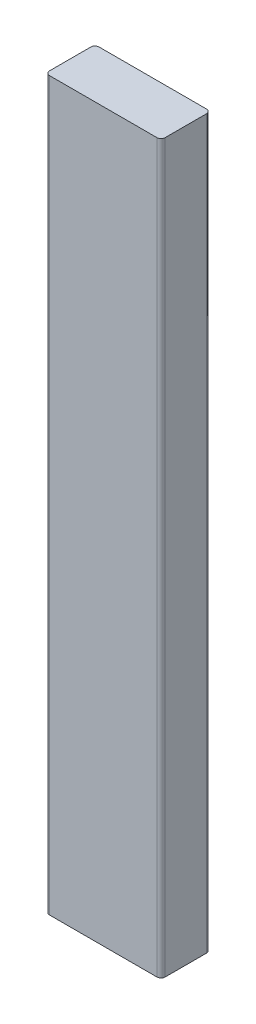
ISO-10303-21;
HEADER;
FILE_DESCRIPTION(('STEP AP214'),'2;1');
FILE_NAME('part.step','',(''),(''),'','','');
FILE_SCHEMA(('AUTOMOTIVE_DESIGN { 1 0 10303 214 1 1 1 1 }'));
ENDSEC;
DATA;
#1=APPLICATION_CONTEXT('core data for automotive mechanical design processes');
#2=APPLICATION_PROTOCOL_DEFINITION('international standard','automotive_design',2000,#1);
#3=PRODUCT_CONTEXT('',#1,'mechanical');
#4=PRODUCT('Part','Part','',(#3));
#5=PRODUCT_RELATED_PRODUCT_CATEGORY('part','',(#4));
#6=PRODUCT_DEFINITION_FORMATION('','',#4);
#7=PRODUCT_DEFINITION_CONTEXT('part definition',#1,'design');
#8=PRODUCT_DEFINITION('design','',#6,#7);
#9=PRODUCT_DEFINITION_SHAPE('','',#8);
#10=(LENGTH_UNIT() NAMED_UNIT(*) SI_UNIT(.MILLI.,.METRE.));
#11=(NAMED_UNIT(*) PLANE_ANGLE_UNIT() SI_UNIT($,.RADIAN.));
#12=(NAMED_UNIT(*) SI_UNIT($,.STERADIAN.) SOLID_ANGLE_UNIT());
#13=UNCERTAINTY_MEASURE_WITH_UNIT(LENGTH_MEASURE(1.E-05),#10,'distance_accuracy_value','');
#14=(GEOMETRIC_REPRESENTATION_CONTEXT(3) GLOBAL_UNCERTAINTY_ASSIGNED_CONTEXT((#13)) GLOBAL_UNIT_ASSIGNED_CONTEXT((#10,
#11,#12)) REPRESENTATION_CONTEXT('',''));
#15=CARTESIAN_POINT('',(0.,0.,0.));
#16=DIRECTION('',(0.,0.,1.));
#17=DIRECTION('',(1.,0.,0.));
#18=AXIS2_PLACEMENT_3D('',#15,#16,#17);
#19=CARTESIAN_POINT('',(-41.275,558.8,15.875));
#20=DIRECTION('',(0.,-1.,0.));
#21=DIRECTION('',(0.,0.,-1.));
#22=AXIS2_PLACEMENT_3D('',#19,#20,#21);
#23=CYLINDRICAL_SURFACE('',#22,3.17499999999999);
#24=CARTESIAN_POINT('',(-41.275,0.,15.875));
#25=DIRECTION('',(0.,1.,0.));
#26=DIRECTION('',(0.,0.,-1.));
#27=AXIS2_PLACEMENT_3D('',#24,#25,#26);
#28=CIRCLE('',#27,3.17499999999999);
#29=CARTESIAN_POINT('',(-44.45,0.,15.875));
#30=VERTEX_POINT('',#29);
#31=CARTESIAN_POINT('',(-41.275,0.,19.05));
#32=VERTEX_POINT('',#31);
#33=EDGE_CURVE('E140',#30,#32,#28,.T.);
#34=ORIENTED_EDGE('',*,*,#33,.T.);
#35=DIRECTION('',(0.,-1.,0.));
#36=VECTOR('',#35,1.);
#37=CARTESIAN_POINT('',(-41.275,558.8,19.05));
#38=LINE('',#37,#36);
#39=CARTESIAN_POINT('',(-41.275,558.8,19.05));
#40=VERTEX_POINT('',#39);
#41=EDGE_CURVE('E11',#40,#32,#38,.T.);
#42=ORIENTED_EDGE('',*,*,#41,.F.);
#43=CARTESIAN_POINT('',(-41.275,558.8,15.875));
#44=DIRECTION('',(0.,1.,0.));
#45=DIRECTION('',(0.,0.,-1.));
#46=AXIS2_PLACEMENT_3D('',#43,#44,#45);
#47=CIRCLE('',#46,3.17499999999999);
#48=CARTESIAN_POINT('',(-44.45,558.8,15.875));
#49=VERTEX_POINT('',#48);
#50=EDGE_CURVE('E162',#49,#40,#47,.T.);
#51=ORIENTED_EDGE('',*,*,#50,.F.);
#52=DIRECTION('',(0.,-1.,0.));
#53=VECTOR('',#52,1.);
#54=CARTESIAN_POINT('',(-44.45,558.8,15.875));
#55=LINE('',#54,#53);
#56=EDGE_CURVE('E136',#49,#30,#55,.T.);
#57=ORIENTED_EDGE('',*,*,#56,.T.);
#58=EDGE_LOOP('',(#34,#42,#51,#57));
#59=FACE_BOUND('',#58,.T.);
#60=ADVANCED_FACE('F39',(#59),#23,.T.);
#61=CARTESIAN_POINT('',(41.275,558.8,19.05));
#62=DIRECTION('',(0.,0.,-1.));
#63=DIRECTION('',(-1.,0.,0.));
#64=AXIS2_PLACEMENT_3D('',#61,#62,#63);
#65=PLANE('',#64);
#66=DIRECTION('',(1.,0.,0.));
#67=VECTOR('',#66,1.);
#68=CARTESIAN_POINT('',(41.275,0.,19.05));
#69=LINE('',#68,#67);
#70=CARTESIAN_POINT('',(41.275,0.,19.05));
#71=VERTEX_POINT('',#70);
#72=EDGE_CURVE('E144',#32,#71,#69,.T.);
#73=ORIENTED_EDGE('',*,*,#72,.T.);
#74=DIRECTION('',(0.,-1.,0.));
#75=VECTOR('',#74,1.);
#76=CARTESIAN_POINT('',(41.275,558.8,19.05));
#77=LINE('',#76,#75);
#78=CARTESIAN_POINT('',(41.275,558.8,19.05));
#79=VERTEX_POINT('',#78);
#80=EDGE_CURVE('E48',#79,#71,#77,.T.);
#81=ORIENTED_EDGE('',*,*,#80,.F.);
#82=DIRECTION('',(1.,0.,0.));
#83=VECTOR('',#82,1.);
#84=CARTESIAN_POINT('',(41.275,558.8,19.05));
#85=LINE('',#84,#83);
#86=EDGE_CURVE('E99',#40,#79,#85,.T.);
#87=ORIENTED_EDGE('',*,*,#86,.F.);
#88=ORIENTED_EDGE('',*,*,#41,.T.);
#89=EDGE_LOOP('',(#73,#81,#87,#88));
#90=FACE_BOUND('',#89,.T.);
#91=ADVANCED_FACE('F208',(#90),#65,.F.);
#92=CARTESIAN_POINT('',(41.275,558.8,15.875));
#93=DIRECTION('',(0.,-1.,0.));
#94=DIRECTION('',(0.,0.,-1.));
#95=AXIS2_PLACEMENT_3D('',#92,#93,#94);
#96=CYLINDRICAL_SURFACE('',#95,3.175);
#97=CARTESIAN_POINT('',(41.275,0.,15.875));
#98=DIRECTION('',(0.,1.,0.));
#99=DIRECTION('',(0.,0.,1.));
#100=AXIS2_PLACEMENT_3D('',#97,#98,#99);
#101=CIRCLE('',#100,3.175);
#102=CARTESIAN_POINT('',(44.45,0.,15.875));
#103=VERTEX_POINT('',#102);
#104=EDGE_CURVE('E147',#71,#103,#101,.T.);
#105=ORIENTED_EDGE('',*,*,#104,.T.);
#106=DIRECTION('',(0.,-1.,0.));
#107=VECTOR('',#106,1.);
#108=CARTESIAN_POINT('',(44.45,558.8,15.875));
#109=LINE('',#108,#107);
#110=CARTESIAN_POINT('',(44.45,558.8,15.875));
#111=VERTEX_POINT('',#110);
#112=EDGE_CURVE('E173',#111,#103,#109,.T.);
#113=ORIENTED_EDGE('',*,*,#112,.F.);
#114=CARTESIAN_POINT('',(41.275,558.8,15.875));
#115=DIRECTION('',(0.,1.,0.));
#116=DIRECTION('',(0.,0.,1.));
#117=AXIS2_PLACEMENT_3D('',#114,#115,#116);
#118=CIRCLE('',#117,3.175);
#119=EDGE_CURVE('E183',#79,#111,#118,.T.);
#120=ORIENTED_EDGE('',*,*,#119,.F.);
#121=ORIENTED_EDGE('',*,*,#80,.T.);
#122=EDGE_LOOP('',(#105,#113,#120,#121));
#123=FACE_BOUND('',#122,.T.);
#124=ADVANCED_FACE('F181',(#123),#96,.T.);
#125=CARTESIAN_POINT('',(44.45,558.8,15.875));
#126=DIRECTION('',(-1.,0.,0.));
#127=DIRECTION('',(0.,0.,1.));
#128=AXIS2_PLACEMENT_3D('',#125,#126,#127);
#129=PLANE('',#128);
#130=DIRECTION('',(0.,0.,-1.));
#131=VECTOR('',#130,1.);
#132=CARTESIAN_POINT('',(44.45,0.,15.875));
#133=LINE('',#132,#131);
#134=CARTESIAN_POINT('',(44.45,0.,-15.875));
#135=VERTEX_POINT('',#134);
#136=EDGE_CURVE('E150',#103,#135,#133,.T.);
#137=ORIENTED_EDGE('',*,*,#136,.T.);
#138=DIRECTION('',(0.,-1.,0.));
#139=VECTOR('',#138,1.);
#140=CARTESIAN_POINT('',(44.45,558.8,-15.875));
#141=LINE('',#140,#139);
#142=CARTESIAN_POINT('',(44.45,558.8,-15.875));
#143=VERTEX_POINT('',#142);
#144=EDGE_CURVE('E169',#143,#135,#141,.T.);
#145=ORIENTED_EDGE('',*,*,#144,.F.);
#146=DIRECTION('',(0.,0.,-1.));
#147=VECTOR('',#146,1.);
#148=CARTESIAN_POINT('',(44.45,558.8,15.875));
#149=LINE('',#148,#147);
#150=EDGE_CURVE('E196',#111,#143,#149,.T.);
#151=ORIENTED_EDGE('',*,*,#150,.F.);
#152=ORIENTED_EDGE('',*,*,#112,.T.);
#153=EDGE_LOOP('',(#137,#145,#151,#152));
#154=FACE_BOUND('',#153,.T.);
#155=ADVANCED_FACE('F191',(#154),#129,.F.);
#156=CARTESIAN_POINT('',(41.275,558.8,-15.875));
#157=DIRECTION('',(0.,-1.,0.));
#158=DIRECTION('',(0.,0.,-1.));
#159=AXIS2_PLACEMENT_3D('',#156,#157,#158);
#160=CYLINDRICAL_SURFACE('',#159,3.175);
#161=CARTESIAN_POINT('',(41.275,0.,-15.875));
#162=DIRECTION('',(0.,1.,0.));
#163=DIRECTION('',(0.,0.,1.));
#164=AXIS2_PLACEMENT_3D('',#161,#162,#163);
#165=CIRCLE('',#164,3.175);
#166=CARTESIAN_POINT('',(41.275,0.,-19.05));
#167=VERTEX_POINT('',#166);
#168=EDGE_CURVE('E153',#135,#167,#165,.T.);
#169=ORIENTED_EDGE('',*,*,#168,.T.);
#170=DIRECTION('',(0.,-1.,0.));
#171=VECTOR('',#170,1.);
#172=CARTESIAN_POINT('',(41.275,558.8,-19.05));
#173=LINE('',#172,#171);
#174=CARTESIAN_POINT('',(41.275,558.8,-19.05));
#175=VERTEX_POINT('',#174);
#176=EDGE_CURVE('E129',#175,#167,#173,.T.);
#177=ORIENTED_EDGE('',*,*,#176,.F.);
#178=CARTESIAN_POINT('',(41.275,558.8,-15.875));
#179=DIRECTION('',(0.,1.,0.));
#180=DIRECTION('',(0.,0.,1.));
#181=AXIS2_PLACEMENT_3D('',#178,#179,#180);
#182=CIRCLE('',#181,3.175);
#183=EDGE_CURVE('E118',#143,#175,#182,.T.);
#184=ORIENTED_EDGE('',*,*,#183,.F.);
#185=ORIENTED_EDGE('',*,*,#144,.T.);
#186=EDGE_LOOP('',(#169,#177,#184,#185));
#187=FACE_BOUND('',#186,.T.);
#188=ADVANCED_FACE('F194',(#187),#160,.T.);
#189=CARTESIAN_POINT('',(41.275,558.8,-19.05));
#190=DIRECTION('',(0.,0.,1.));
#191=DIRECTION('',(1.,0.,0.));
#192=AXIS2_PLACEMENT_3D('',#189,#190,#191);
#193=PLANE('',#192);
#194=DIRECTION('',(-1.,0.,0.));
#195=VECTOR('',#194,1.);
#196=CARTESIAN_POINT('',(41.275,0.,-19.05));
#197=LINE('',#196,#195);
#198=CARTESIAN_POINT('',(-41.275,0.,-19.05));
#199=VERTEX_POINT('',#198);
#200=EDGE_CURVE('E127',#167,#199,#197,.T.);
#201=ORIENTED_EDGE('',*,*,#200,.T.);
#202=DIRECTION('',(0.,-1.,0.));
#203=VECTOR('',#202,1.);
#204=CARTESIAN_POINT('',(-41.275,558.8,-19.05));
#205=LINE('',#204,#203);
#206=CARTESIAN_POINT('',(-41.275,558.8,-19.05));
#207=VERTEX_POINT('',#206);
#208=EDGE_CURVE('E124',#207,#199,#205,.T.);
#209=ORIENTED_EDGE('',*,*,#208,.F.);
#210=DIRECTION('',(-1.,0.,0.));
#211=VECTOR('',#210,1.);
#212=CARTESIAN_POINT('',(41.275,558.8,-19.05));
#213=LINE('',#212,#211);
#214=EDGE_CURVE('E112',#175,#207,#213,.T.);
#215=ORIENTED_EDGE('',*,*,#214,.F.);
#216=ORIENTED_EDGE('',*,*,#176,.T.);
#217=EDGE_LOOP('',(#201,#209,#215,#216));
#218=FACE_BOUND('',#217,.T.);
#219=ADVANCED_FACE('F125',(#218),#193,.F.);
#220=CARTESIAN_POINT('',(-41.275,558.8,-15.875));
#221=DIRECTION('',(0.,-1.,0.));
#222=DIRECTION('',(0.,0.,-1.));
#223=AXIS2_PLACEMENT_3D('',#220,#221,#222);
#224=CYLINDRICAL_SURFACE('',#223,3.17500000000001);
#225=CARTESIAN_POINT('',(-41.275,0.,-15.875));
#226=DIRECTION('',(0.,1.,0.));
#227=DIRECTION('',(0.,0.,1.));
#228=AXIS2_PLACEMENT_3D('',#225,#226,#227);
#229=CIRCLE('',#228,3.17500000000001);
#230=CARTESIAN_POINT('',(-44.45,0.,-15.875));
#231=VERTEX_POINT('',#230);
#232=EDGE_CURVE('E85',#199,#231,#229,.T.);
#233=ORIENTED_EDGE('',*,*,#232,.T.);
#234=DIRECTION('',(0.,-1.,0.));
#235=VECTOR('',#234,1.);
#236=CARTESIAN_POINT('',(-44.45,558.8,-15.875));
#237=LINE('',#236,#235);
#238=CARTESIAN_POINT('',(-44.45,558.8,-15.875));
#239=VERTEX_POINT('',#238);
#240=EDGE_CURVE('E130',#239,#231,#237,.T.);
#241=ORIENTED_EDGE('',*,*,#240,.F.);
#242=CARTESIAN_POINT('',(-41.275,558.8,-15.875));
#243=DIRECTION('',(0.,1.,0.));
#244=DIRECTION('',(0.,0.,1.));
#245=AXIS2_PLACEMENT_3D('',#242,#243,#244);
#246=CIRCLE('',#245,3.17500000000001);
#247=EDGE_CURVE('E116',#207,#239,#246,.T.);
#248=ORIENTED_EDGE('',*,*,#247,.F.);
#249=ORIENTED_EDGE('',*,*,#208,.T.);
#250=EDGE_LOOP('',(#233,#241,#248,#249));
#251=FACE_BOUND('',#250,.T.);
#252=ADVANCED_FACE('F132',(#251),#224,.T.);
#253=CARTESIAN_POINT('',(-44.45,558.8,15.875));
#254=DIRECTION('',(1.,0.,0.));
#255=DIRECTION('',(0.,0.,-1.));
#256=AXIS2_PLACEMENT_3D('',#253,#254,#255);
#257=PLANE('',#256);
#258=DIRECTION('',(0.,0.,1.));
#259=VECTOR('',#258,1.);
#260=CARTESIAN_POINT('',(-44.45,0.,15.875));
#261=LINE('',#260,#259);
#262=EDGE_CURVE('E91',#231,#30,#261,.T.);
#263=ORIENTED_EDGE('',*,*,#262,.T.);
#264=ORIENTED_EDGE('',*,*,#56,.F.);
#265=DIRECTION('',(0.,0.,1.));
#266=VECTOR('',#265,1.);
#267=CARTESIAN_POINT('',(-44.45,558.8,15.875));
#268=LINE('',#267,#266);
#269=EDGE_CURVE('E56',#239,#49,#268,.T.);
#270=ORIENTED_EDGE('',*,*,#269,.F.);
#271=ORIENTED_EDGE('',*,*,#240,.T.);
#272=EDGE_LOOP('',(#263,#264,#270,#271));
#273=FACE_BOUND('',#272,.T.);
#274=ADVANCED_FACE('F224',(#273),#257,.F.);
#275=CARTESIAN_POINT('',(-41.275,558.8,15.875));
#276=DIRECTION('',(0.,-1.,0.));
#277=DIRECTION('',(0.,0.,-1.));
#278=AXIS2_PLACEMENT_3D('',#275,#276,#277);
#279=PLANE('',#278);
#280=ORIENTED_EDGE('',*,*,#50,.T.);
#281=ORIENTED_EDGE('',*,*,#86,.T.);
#282=ORIENTED_EDGE('',*,*,#119,.T.);
#283=ORIENTED_EDGE('',*,*,#150,.T.);
#284=ORIENTED_EDGE('',*,*,#183,.T.);
#285=ORIENTED_EDGE('',*,*,#214,.T.);
#286=ORIENTED_EDGE('',*,*,#247,.T.);
#287=ORIENTED_EDGE('',*,*,#269,.T.);
#288=EDGE_LOOP('',(#280,#281,#282,#283,#284,#285,#286,#287));
#289=FACE_BOUND('',#288,.T.);
#290=ADVANCED_FACE('F114',(#289),#279,.F.);
#291=CARTESIAN_POINT('',(-41.275,0.,15.875));
#292=DIRECTION('',(0.,-1.,0.));
#293=DIRECTION('',(0.,0.,-1.));
#294=AXIS2_PLACEMENT_3D('',#291,#292,#293);
#295=PLANE('',#294);
#296=ORIENTED_EDGE('',*,*,#33,.F.);
#297=ORIENTED_EDGE('',*,*,#262,.F.);
#298=ORIENTED_EDGE('',*,*,#232,.F.);
#299=ORIENTED_EDGE('',*,*,#200,.F.);
#300=ORIENTED_EDGE('',*,*,#168,.F.);
#301=ORIENTED_EDGE('',*,*,#136,.F.);
#302=ORIENTED_EDGE('',*,*,#104,.F.);
#303=ORIENTED_EDGE('',*,*,#72,.F.);
#304=EDGE_LOOP('',(#296,#297,#298,#299,#300,#301,#302,#303));
#305=FACE_BOUND('',#304,.T.);
#306=ADVANCED_FACE('F187',(#305),#295,.T.);
#307=CLOSED_SHELL('',(#60,#91,#124,#155,#188,#219,#252,#274,#290,#306));
#308=MANIFOLD_SOLID_BREP('B2',#307);
#309=ADVANCED_BREP_SHAPE_REPRESENTATION('',(#18,#308),#14);
#310=SHAPE_DEFINITION_REPRESENTATION(#9,#309);
ENDSEC;
END-ISO-10303-21;
